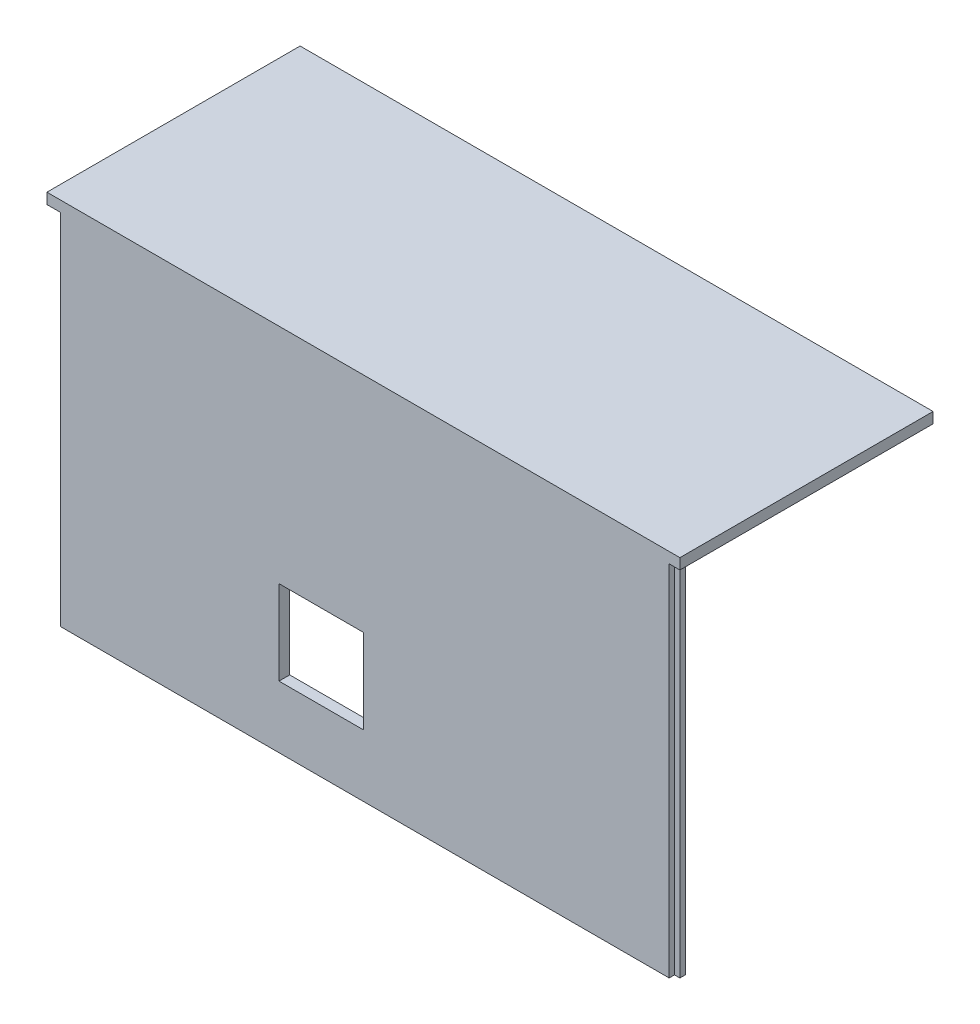
ISO-10303-21;
HEADER;
FILE_DESCRIPTION(('STEP AP214'),'2;1');
FILE_NAME('part.step','',(''),(''),'','','');
FILE_SCHEMA(('AUTOMOTIVE_DESIGN { 1 0 10303 214 1 1 1 1 }'));
ENDSEC;
DATA;
#1=APPLICATION_CONTEXT('core data for automotive mechanical design processes');
#2=APPLICATION_PROTOCOL_DEFINITION('international standard','automotive_design',2000,#1);
#3=PRODUCT_CONTEXT('',#1,'mechanical');
#4=PRODUCT('Part','Part','',(#3));
#5=PRODUCT_RELATED_PRODUCT_CATEGORY('part','',(#4));
#6=PRODUCT_DEFINITION_FORMATION('','',#4);
#7=PRODUCT_DEFINITION_CONTEXT('part definition',#1,'design');
#8=PRODUCT_DEFINITION('design','',#6,#7);
#9=PRODUCT_DEFINITION_SHAPE('','',#8);
#10=(LENGTH_UNIT() NAMED_UNIT(*) SI_UNIT(.MILLI.,.METRE.));
#11=(NAMED_UNIT(*) PLANE_ANGLE_UNIT() SI_UNIT($,.RADIAN.));
#12=(NAMED_UNIT(*) SI_UNIT($,.STERADIAN.) SOLID_ANGLE_UNIT());
#13=UNCERTAINTY_MEASURE_WITH_UNIT(LENGTH_MEASURE(1.E-05),#10,'distance_accuracy_value','');
#14=(GEOMETRIC_REPRESENTATION_CONTEXT(3) GLOBAL_UNCERTAINTY_ASSIGNED_CONTEXT((#13)) GLOBAL_UNIT_ASSIGNED_CONTEXT((#10,
#11,#12)) REPRESENTATION_CONTEXT('',''));
#15=CARTESIAN_POINT('',(0.,0.,0.));
#16=DIRECTION('',(0.,0.,1.));
#17=DIRECTION('',(1.,0.,0.));
#18=AXIS2_PLACEMENT_3D('',#15,#16,#17);
#19=CARTESIAN_POINT('',(-72.8419921910765,-37.8581661594516,2.54));
#20=DIRECTION('',(0.,1.,0.));
#21=DIRECTION('',(0.,0.,1.));
#22=AXIS2_PLACEMENT_3D('',#19,#20,#21);
#23=PLANE('',#22);
#24=DIRECTION('',(1.,0.,0.));
#25=VECTOR('',#24,1.);
#26=CARTESIAN_POINT('',(-72.8419921910765,-37.8581661594516,2.54));
#27=LINE('',#26,#25);
#28=CARTESIAN_POINT('',(-69.6669921910764,-37.8581661594516,2.54));
#29=VERTEX_POINT('',#28);
#30=CARTESIAN_POINT('',(74.6180078089236,-37.8581661594516,2.54));
#31=VERTEX_POINT('',#30);
#32=EDGE_CURVE('E343',#29,#31,#27,.T.);
#33=ORIENTED_EDGE('',*,*,#32,.F.);
#34=DIRECTION('',(0.,0.,-1.));
#35=VECTOR('',#34,1.);
#36=CARTESIAN_POINT('',(-69.6669921910764,-37.8581661594516,1.27));
#37=LINE('',#36,#35);
#38=CARTESIAN_POINT('',(-69.6669921910764,-37.8581661594516,1.27));
#39=VERTEX_POINT('',#38);
#40=EDGE_CURVE('E214',#29,#39,#37,.T.);
#41=ORIENTED_EDGE('',*,*,#40,.T.);
#42=DIRECTION('',(-1.,0.,0.));
#43=VECTOR('',#42,1.);
#44=CARTESIAN_POINT('',(-70.9369921910764,-37.8581661594516,1.27));
#45=LINE('',#44,#43);
#46=CARTESIAN_POINT('',(-70.9369921910764,-37.8581661594516,1.27));
#47=VERTEX_POINT('',#46);
#48=EDGE_CURVE('E205',#39,#47,#45,.T.);
#49=ORIENTED_EDGE('',*,*,#48,.T.);
#50=DIRECTION('',(0.,0.,-1.));
#51=VECTOR('',#50,1.);
#52=CARTESIAN_POINT('',(-70.9369921910764,-37.8581661594516,0.));
#53=LINE('',#52,#51);
#54=CARTESIAN_POINT('',(-70.9369921910764,-37.8581661594516,0.));
#55=VERTEX_POINT('',#54);
#56=EDGE_CURVE('E209',#47,#55,#53,.T.);
#57=ORIENTED_EDGE('',*,*,#56,.T.);
#58=DIRECTION('',(1.,0.,0.));
#59=VECTOR('',#58,1.);
#60=CARTESIAN_POINT('',(-72.8419921910765,-37.8581661594516,0.));
#61=LINE('',#60,#59);
#62=CARTESIAN_POINT('',(75.8880078089236,-37.8581661594516,0.));
#63=VERTEX_POINT('',#62);
#64=EDGE_CURVE('E333',#55,#63,#61,.T.);
#65=ORIENTED_EDGE('',*,*,#64,.T.);
#66=DIRECTION('',(0.,0.,1.));
#67=VECTOR('',#66,1.);
#68=CARTESIAN_POINT('',(75.8880078089236,-37.8581661594516,0.));
#69=LINE('',#68,#67);
#70=CARTESIAN_POINT('',(75.8880078089236,-37.8581661594516,1.27));
#71=VERTEX_POINT('',#70);
#72=EDGE_CURVE('E64',#63,#71,#69,.T.);
#73=ORIENTED_EDGE('',*,*,#72,.T.);
#74=DIRECTION('',(-1.,0.,0.));
#75=VECTOR('',#74,1.);
#76=CARTESIAN_POINT('',(75.8880078089236,-37.8581661594516,1.27));
#77=LINE('',#76,#75);
#78=CARTESIAN_POINT('',(74.6180078089236,-37.8581661594516,1.27));
#79=VERTEX_POINT('',#78);
#80=EDGE_CURVE('E270',#71,#79,#77,.T.);
#81=ORIENTED_EDGE('',*,*,#80,.T.);
#82=DIRECTION('',(0.,0.,1.));
#83=VECTOR('',#82,1.);
#84=CARTESIAN_POINT('',(74.6180078089236,-37.8581661594516,1.27));
#85=LINE('',#84,#83);
#86=EDGE_CURVE('E248',#79,#31,#85,.T.);
#87=ORIENTED_EDGE('',*,*,#86,.T.);
#88=EDGE_LOOP('',(#33,#41,#49,#57,#65,#73,#81,#87));
#89=FACE_BOUND('',#88,.T.);
#90=ADVANCED_FACE('F49',(#89),#23,.F.);
#91=CARTESIAN_POINT('',(0.,0.,2.54));
#92=DIRECTION('',(0.,0.,1.));
#93=DIRECTION('',(1.,0.,0.));
#94=AXIS2_PLACEMENT_3D('',#91,#92,#93);
#95=PLANE('',#94);
#96=DIRECTION('',(0.,1.,0.));
#97=VECTOR('',#96,1.);
#98=CARTESIAN_POINT('',(-69.6669921910764,-37.8581661594516,2.54));
#99=LINE('',#98,#97);
#100=CARTESIAN_POINT('',(-69.6669921910764,47.1418338405484,2.54));
#101=VERTEX_POINT('',#100);
#102=EDGE_CURVE('E235',#29,#101,#99,.T.);
#103=ORIENTED_EDGE('',*,*,#102,.F.);
#104=ORIENTED_EDGE('',*,*,#32,.T.);
#105=DIRECTION('',(0.,1.,0.));
#106=VECTOR('',#105,1.);
#107=CARTESIAN_POINT('',(74.6180078089236,-37.8581661594516,2.54));
#108=LINE('',#107,#106);
#109=CARTESIAN_POINT('',(74.6180078089236,47.1418338405484,2.54));
#110=VERTEX_POINT('',#109);
#111=EDGE_CURVE('E191',#31,#110,#108,.T.);
#112=ORIENTED_EDGE('',*,*,#111,.T.);
#113=DIRECTION('',(1.,0.,0.));
#114=VECTOR('',#113,1.);
#115=CARTESIAN_POINT('',(-72.8419921910765,47.1418338405484,2.54));
#116=LINE('',#115,#114);
#117=CARTESIAN_POINT('',(77.1580078089235,47.1418338405484,2.54));
#118=VERTEX_POINT('',#117);
#119=EDGE_CURVE('E391',#110,#118,#116,.T.);
#120=ORIENTED_EDGE('',*,*,#119,.T.);
#121=DIRECTION('',(0.,-1.,0.));
#122=VECTOR('',#121,1.);
#123=CARTESIAN_POINT('',(77.1580078089235,49.6818338405484,2.54));
#124=LINE('',#123,#122);
#125=CARTESIAN_POINT('',(77.1580078089235,49.6818338405484,2.54));
#126=VERTEX_POINT('',#125);
#127=EDGE_CURVE('E201',#126,#118,#124,.T.);
#128=ORIENTED_EDGE('',*,*,#127,.F.);
#129=DIRECTION('',(1.,0.,0.));
#130=VECTOR('',#129,1.);
#131=CARTESIAN_POINT('',(-72.8419921910765,49.6818338405484,2.54));
#132=LINE('',#131,#130);
#133=CARTESIAN_POINT('',(-72.8419921910765,49.6818338405484,2.54));
#134=VERTEX_POINT('',#133);
#135=EDGE_CURVE('E174',#134,#126,#132,.T.);
#136=ORIENTED_EDGE('',*,*,#135,.F.);
#137=DIRECTION('',(0.,-1.,0.));
#138=VECTOR('',#137,1.);
#139=CARTESIAN_POINT('',(-72.8419921910765,49.6818338405484,2.54));
#140=LINE('',#139,#138);
#141=CARTESIAN_POINT('',(-72.8419921910765,47.1418338405484,2.54));
#142=VERTEX_POINT('',#141);
#143=EDGE_CURVE('E170',#134,#142,#140,.T.);
#144=ORIENTED_EDGE('',*,*,#143,.T.);
#145=EDGE_CURVE('E385',#142,#101,#116,.T.);
#146=ORIENTED_EDGE('',*,*,#145,.T.);
#147=EDGE_LOOP('',(#103,#104,#112,#120,#128,#136,#144,#146));
#148=FACE_BOUND('',#147,.T.);
#149=DIRECTION('',(0.,-1.,0.));
#150=VECTOR('',#149,1.);
#151=CARTESIAN_POINT('',(2.15800780892356,-23.1581661594516,2.54));
#152=LINE('',#151,#150);
#153=CARTESIAN_POINT('',(2.15800780892356,-3.15816615945164,2.54));
#154=VERTEX_POINT('',#153);
#155=CARTESIAN_POINT('',(2.15800780892356,-23.1581661594516,2.54));
#156=VERTEX_POINT('',#155);
#157=EDGE_CURVE('E300',#154,#156,#152,.T.);
#158=ORIENTED_EDGE('',*,*,#157,.T.);
#159=DIRECTION('',(-1.,0.,0.));
#160=VECTOR('',#159,1.);
#161=CARTESIAN_POINT('',(-17.8419921910764,-23.1581661594516,2.54));
#162=LINE('',#161,#160);
#163=CARTESIAN_POINT('',(-17.8419921910764,-23.1581661594516,2.54));
#164=VERTEX_POINT('',#163);
#165=EDGE_CURVE('E304',#156,#164,#162,.T.);
#166=ORIENTED_EDGE('',*,*,#165,.T.);
#167=DIRECTION('',(0.,1.,0.));
#168=VECTOR('',#167,1.);
#169=CARTESIAN_POINT('',(-17.8419921910764,-23.1581661594516,2.54));
#170=LINE('',#169,#168);
#171=CARTESIAN_POINT('',(-17.8419921910764,-3.15816615945163,2.54));
#172=VERTEX_POINT('',#171);
#173=EDGE_CURVE('E309',#164,#172,#170,.T.);
#174=ORIENTED_EDGE('',*,*,#173,.T.);
#175=DIRECTION('',(1.,0.,0.));
#176=VECTOR('',#175,1.);
#177=CARTESIAN_POINT('',(-17.8419921910764,-3.15816615945163,2.54));
#178=LINE('',#177,#176);
#179=EDGE_CURVE('E313',#172,#154,#178,.T.);
#180=ORIENTED_EDGE('',*,*,#179,.T.);
#181=EDGE_LOOP('',(#158,#166,#174,#180));
#182=FACE_BOUND('',#181,.T.);
#183=ADVANCED_FACE('F362',(#148,#182),#95,.T.);
#184=CARTESIAN_POINT('',(0.,0.,0.));
#185=DIRECTION('',(0.,0.,1.));
#186=DIRECTION('',(1.,0.,0.));
#187=AXIS2_PLACEMENT_3D('',#184,#185,#186);
#188=PLANE('',#187);
#189=CARTESIAN_POINT('',(51.1580078089236,-21.8581661594516,0.));
#190=DIRECTION('',(0.,0.,1.));
#191=DIRECTION('',(1.,0.,0.));
#192=AXIS2_PLACEMENT_3D('',#189,#190,#191);
#193=CIRCLE('',#192,3.);
#194=CARTESIAN_POINT('',(54.1580078089236,-21.8581661594516,0.));
#195=VERTEX_POINT('',#194);
#196=EDGE_CURVE('E11',#195,#195,#193,.F.);
#197=ORIENTED_EDGE('',*,*,#196,.F.);
#198=EDGE_LOOP('',(#197));
#199=FACE_BOUND('',#198,.T.);
#200=CARTESIAN_POINT('',(16.1580078089236,-21.8581661594516,0.));
#201=DIRECTION('',(0.,0.,1.));
#202=DIRECTION('',(1.,0.,0.));
#203=AXIS2_PLACEMENT_3D('',#200,#201,#202);
#204=CIRCLE('',#203,3.);
#205=CARTESIAN_POINT('',(19.1580078089236,-21.8581661594516,0.));
#206=VERTEX_POINT('',#205);
#207=EDGE_CURVE('E57',#206,#206,#204,.F.);
#208=ORIENTED_EDGE('',*,*,#207,.F.);
#209=EDGE_LOOP('',(#208));
#210=FACE_BOUND('',#209,.T.);
#211=DIRECTION('',(-1.,0.,0.));
#212=VECTOR('',#211,1.);
#213=CARTESIAN_POINT('',(-17.8419921910764,-23.1581661594516,0.));
#214=LINE('',#213,#212);
#215=CARTESIAN_POINT('',(2.15800780892356,-23.1581661594516,0.));
#216=VERTEX_POINT('',#215);
#217=CARTESIAN_POINT('',(-17.8419921910764,-23.1581661594516,0.));
#218=VERTEX_POINT('',#217);
#219=EDGE_CURVE('E320',#216,#218,#214,.T.);
#220=ORIENTED_EDGE('',*,*,#219,.F.);
#221=DIRECTION('',(0.,-1.,0.));
#222=VECTOR('',#221,1.);
#223=CARTESIAN_POINT('',(2.15800780892356,-23.1581661594516,0.));
#224=LINE('',#223,#222);
#225=CARTESIAN_POINT('',(2.15800780892356,-3.15816615945164,0.));
#226=VERTEX_POINT('',#225);
#227=EDGE_CURVE('E296',#226,#216,#224,.T.);
#228=ORIENTED_EDGE('',*,*,#227,.F.);
#229=DIRECTION('',(1.,0.,0.));
#230=VECTOR('',#229,1.);
#231=CARTESIAN_POINT('',(-17.8419921910764,-3.15816615945163,0.));
#232=LINE('',#231,#230);
#233=CARTESIAN_POINT('',(-17.8419921910764,-3.15816615945163,0.));
#234=VERTEX_POINT('',#233);
#235=EDGE_CURVE('E305',#234,#226,#232,.T.);
#236=ORIENTED_EDGE('',*,*,#235,.F.);
#237=DIRECTION('',(0.,1.,0.));
#238=VECTOR('',#237,1.);
#239=CARTESIAN_POINT('',(-17.8419921910764,-23.1581661594516,0.));
#240=LINE('',#239,#238);
#241=EDGE_CURVE('E323',#218,#234,#240,.T.);
#242=ORIENTED_EDGE('',*,*,#241,.F.);
#243=EDGE_LOOP('',(#220,#228,#236,#242));
#244=FACE_BOUND('',#243,.T.);
#245=ORIENTED_EDGE('',*,*,#64,.F.);
#246=DIRECTION('',(0.,1.,0.));
#247=VECTOR('',#246,1.);
#248=CARTESIAN_POINT('',(-70.9369921910764,-37.8581661594516,0.));
#249=LINE('',#248,#247);
#250=CARTESIAN_POINT('',(-70.9369921910764,47.1418338405484,0.));
#251=VERTEX_POINT('',#250);
#252=EDGE_CURVE('E238',#55,#251,#249,.T.);
#253=ORIENTED_EDGE('',*,*,#252,.T.);
#254=DIRECTION('',(-1.,0.,0.));
#255=VECTOR('',#254,1.);
#256=CARTESIAN_POINT('',(-72.8419921910764,47.1418338405484,0.));
#257=LINE('',#256,#255);
#258=CARTESIAN_POINT('',(75.8880078089236,47.1418338405484,0.));
#259=VERTEX_POINT('',#258);
#260=EDGE_CURVE('E72',#259,#251,#257,.T.);
#261=ORIENTED_EDGE('',*,*,#260,.F.);
#262=DIRECTION('',(0.,1.,0.));
#263=VECTOR('',#262,1.);
#264=CARTESIAN_POINT('',(75.8880078089236,-37.8581661594516,0.));
#265=LINE('',#264,#263);
#266=EDGE_CURVE('E245',#63,#259,#265,.T.);
#267=ORIENTED_EDGE('',*,*,#266,.F.);
#268=EDGE_LOOP('',(#245,#253,#261,#267));
#269=FACE_BOUND('',#268,.T.);
#270=ADVANCED_FACE('F358',(#199,#210,#244,#269),#188,.F.);
#271=CARTESIAN_POINT('',(2.15800780892356,-23.1581661594516,2.54));
#272=DIRECTION('',(1.,0.,0.));
#273=DIRECTION('',(0.,1.,0.));
#274=AXIS2_PLACEMENT_3D('',#271,#272,#273);
#275=PLANE('',#274);
#276=ORIENTED_EDGE('',*,*,#227,.T.);
#277=DIRECTION('',(0.,0.,-1.));
#278=VECTOR('',#277,1.);
#279=CARTESIAN_POINT('',(2.15800780892356,-23.1581661594516,2.54));
#280=LINE('',#279,#278);
#281=EDGE_CURVE('E317',#156,#216,#280,.T.);
#282=ORIENTED_EDGE('',*,*,#281,.F.);
#283=ORIENTED_EDGE('',*,*,#157,.F.);
#284=DIRECTION('',(0.,0.,-1.));
#285=VECTOR('',#284,1.);
#286=CARTESIAN_POINT('',(2.15800780892356,-3.15816615945164,2.54));
#287=LINE('',#286,#285);
#288=EDGE_CURVE('E330',#154,#226,#287,.T.);
#289=ORIENTED_EDGE('',*,*,#288,.T.);
#290=EDGE_LOOP('',(#276,#282,#283,#289));
#291=FACE_BOUND('',#290,.T.);
#292=ADVANCED_FACE('F361',(#291),#275,.F.);
#293=CARTESIAN_POINT('',(-17.8419921910764,-3.15816615945163,2.54));
#294=DIRECTION('',(0.,1.,0.));
#295=DIRECTION('',(-1.,0.,0.));
#296=AXIS2_PLACEMENT_3D('',#293,#294,#295);
#297=PLANE('',#296);
#298=ORIENTED_EDGE('',*,*,#235,.T.);
#299=ORIENTED_EDGE('',*,*,#288,.F.);
#300=ORIENTED_EDGE('',*,*,#179,.F.);
#301=DIRECTION('',(0.,0.,-1.));
#302=VECTOR('',#301,1.);
#303=CARTESIAN_POINT('',(-17.8419921910764,-3.15816615945163,2.54));
#304=LINE('',#303,#302);
#305=EDGE_CURVE('E334',#172,#234,#304,.T.);
#306=ORIENTED_EDGE('',*,*,#305,.T.);
#307=EDGE_LOOP('',(#298,#299,#300,#306));
#308=FACE_BOUND('',#307,.T.);
#309=ADVANCED_FACE('F484',(#308),#297,.F.);
#310=CARTESIAN_POINT('',(-17.8419921910764,-23.1581661594516,2.54));
#311=DIRECTION('',(-1.,0.,0.));
#312=DIRECTION('',(0.,-1.,0.));
#313=AXIS2_PLACEMENT_3D('',#310,#311,#312);
#314=PLANE('',#313);
#315=ORIENTED_EDGE('',*,*,#241,.T.);
#316=ORIENTED_EDGE('',*,*,#305,.F.);
#317=ORIENTED_EDGE('',*,*,#173,.F.);
#318=DIRECTION('',(0.,0.,-1.));
#319=VECTOR('',#318,1.);
#320=CARTESIAN_POINT('',(-17.8419921910764,-23.1581661594516,2.54));
#321=LINE('',#320,#319);
#322=EDGE_CURVE('E337',#164,#218,#321,.T.);
#323=ORIENTED_EDGE('',*,*,#322,.T.);
#324=EDGE_LOOP('',(#315,#316,#317,#323));
#325=FACE_BOUND('',#324,.T.);
#326=ADVANCED_FACE('F489',(#325),#314,.F.);
#327=CARTESIAN_POINT('',(-17.8419921910764,-23.1581661594516,2.54));
#328=DIRECTION('',(0.,-1.,0.));
#329=DIRECTION('',(1.,0.,0.));
#330=AXIS2_PLACEMENT_3D('',#327,#328,#329);
#331=PLANE('',#330);
#332=ORIENTED_EDGE('',*,*,#219,.T.);
#333=ORIENTED_EDGE('',*,*,#322,.F.);
#334=ORIENTED_EDGE('',*,*,#165,.F.);
#335=ORIENTED_EDGE('',*,*,#281,.T.);
#336=EDGE_LOOP('',(#332,#333,#334,#335));
#337=FACE_BOUND('',#336,.T.);
#338=ADVANCED_FACE('F486',(#337),#331,.F.);
#339=CARTESIAN_POINT('',(16.1580078089236,-21.8581661594516,-8.));
#340=DIRECTION('',(0.,0.,1.));
#341=DIRECTION('',(1.,0.,0.));
#342=AXIS2_PLACEMENT_3D('',#339,#340,#341);
#343=CYLINDRICAL_SURFACE('',#342,3.);
#344=CARTESIAN_POINT('',(16.1580078089236,-21.8581661594516,-8.));
#345=DIRECTION('',(0.,0.,-1.));
#346=DIRECTION('',(-1.,0.,0.));
#347=AXIS2_PLACEMENT_3D('',#344,#345,#346);
#348=CIRCLE('',#347,3.);
#349=CARTESIAN_POINT('',(13.1580078089236,-21.8581661594516,-8.));
#350=VERTEX_POINT('',#349);
#351=EDGE_CURVE('E280',#350,#350,#348,.T.);
#352=ORIENTED_EDGE('',*,*,#351,.F.);
#353=EDGE_LOOP('',(#352));
#354=FACE_BOUND('',#353,.T.);
#355=ORIENTED_EDGE('',*,*,#207,.T.);
#356=EDGE_LOOP('',(#355));
#357=FACE_BOUND('',#356,.T.);
#358=ADVANCED_FACE('F356',(#354,#357),#343,.T.);
#359=CARTESIAN_POINT('',(16.1580078089236,-21.8581661594516,-8.));
#360=DIRECTION('',(0.,0.,-1.));
#361=DIRECTION('',(-1.,0.,0.));
#362=AXIS2_PLACEMENT_3D('',#359,#360,#361);
#363=PLANE('',#362);
#364=CARTESIAN_POINT('',(16.1580078089236,-21.8581661594516,-8.));
#365=DIRECTION('',(0.,0.,-1.));
#366=DIRECTION('',(-1.,0.,0.));
#367=AXIS2_PLACEMENT_3D('',#364,#365,#366);
#368=CIRCLE('',#367,0.499999999999999);
#369=CARTESIAN_POINT('',(15.6580078089236,-21.8581661594516,-8.));
#370=VERTEX_POINT('',#369);
#371=EDGE_CURVE('E285',#370,#370,#368,.T.);
#372=ORIENTED_EDGE('',*,*,#371,.F.);
#373=EDGE_LOOP('',(#372));
#374=FACE_BOUND('',#373,.T.);
#375=ORIENTED_EDGE('',*,*,#351,.T.);
#376=EDGE_LOOP('',(#375));
#377=FACE_BOUND('',#376,.T.);
#378=ADVANCED_FACE('F497',(#374,#377),#363,.T.);
#379=CARTESIAN_POINT('',(51.1580078089236,-21.8581661594516,-8.));
#380=DIRECTION('',(0.,0.,1.));
#381=DIRECTION('',(1.,0.,0.));
#382=AXIS2_PLACEMENT_3D('',#379,#380,#381);
#383=CYLINDRICAL_SURFACE('',#382,3.);
#384=CARTESIAN_POINT('',(51.1580078089236,-21.8581661594516,-8.));
#385=DIRECTION('',(0.,0.,-1.));
#386=DIRECTION('',(-1.,0.,0.));
#387=AXIS2_PLACEMENT_3D('',#384,#385,#386);
#388=CIRCLE('',#387,3.);
#389=CARTESIAN_POINT('',(48.1580078089236,-21.8581661594516,-8.));
#390=VERTEX_POINT('',#389);
#391=EDGE_CURVE('E292',#390,#390,#388,.T.);
#392=ORIENTED_EDGE('',*,*,#391,.F.);
#393=EDGE_LOOP('',(#392));
#394=FACE_BOUND('',#393,.T.);
#395=ORIENTED_EDGE('',*,*,#196,.T.);
#396=EDGE_LOOP('',(#395));
#397=FACE_BOUND('',#396,.T.);
#398=ADVANCED_FACE('F500',(#394,#397),#383,.T.);
#399=CARTESIAN_POINT('',(51.1580078089236,-21.8581661594516,-8.));
#400=DIRECTION('',(0.,0.,-1.));
#401=DIRECTION('',(-1.,0.,0.));
#402=AXIS2_PLACEMENT_3D('',#399,#400,#401);
#403=PLANE('',#402);
#404=CARTESIAN_POINT('',(51.1580078089236,-21.8581661594516,-8.));
#405=DIRECTION('',(0.,0.,-1.));
#406=DIRECTION('',(-1.,0.,0.));
#407=AXIS2_PLACEMENT_3D('',#404,#405,#406);
#408=CIRCLE('',#407,0.499999999999999);
#409=CARTESIAN_POINT('',(50.6580078089236,-21.8581661594516,-8.));
#410=VERTEX_POINT('',#409);
#411=EDGE_CURVE('E281',#410,#410,#408,.T.);
#412=ORIENTED_EDGE('',*,*,#411,.F.);
#413=EDGE_LOOP('',(#412));
#414=FACE_BOUND('',#413,.T.);
#415=ORIENTED_EDGE('',*,*,#391,.T.);
#416=EDGE_LOOP('',(#415));
#417=FACE_BOUND('',#416,.T.);
#418=ADVANCED_FACE('F507',(#414,#417),#403,.T.);
#419=CARTESIAN_POINT('',(51.1580078089236,-21.8581661594516,-4.));
#420=DIRECTION('',(0.,0.,-1.));
#421=DIRECTION('',(-1.,0.,0.));
#422=AXIS2_PLACEMENT_3D('',#419,#420,#421);
#423=CYLINDRICAL_SURFACE('',#422,0.499999999999999);
#424=CARTESIAN_POINT('',(51.1580078089236,-21.8581661594516,-4.));
#425=DIRECTION('',(0.,0.,-1.));
#426=DIRECTION('',(-1.,0.,0.));
#427=AXIS2_PLACEMENT_3D('',#424,#425,#426);
#428=CIRCLE('',#427,0.499999999999999);
#429=CARTESIAN_POINT('',(50.6580078089236,-21.8581661594516,-4.));
#430=VERTEX_POINT('',#429);
#431=EDGE_CURVE('E276',#430,#430,#428,.T.);
#432=ORIENTED_EDGE('',*,*,#431,.F.);
#433=EDGE_LOOP('',(#432));
#434=FACE_BOUND('',#433,.T.);
#435=ORIENTED_EDGE('',*,*,#411,.T.);
#436=EDGE_LOOP('',(#435));
#437=FACE_BOUND('',#436,.T.);
#438=ADVANCED_FACE('F511',(#434,#437),#423,.F.);
#439=CARTESIAN_POINT('',(51.1580078089236,-21.8581661594516,-4.));
#440=DIRECTION('',(0.,0.,-1.));
#441=DIRECTION('',(-1.,0.,0.));
#442=AXIS2_PLACEMENT_3D('',#439,#440,#441);
#443=PLANE('',#442);
#444=ORIENTED_EDGE('',*,*,#431,.T.);
#445=EDGE_LOOP('',(#444));
#446=FACE_BOUND('',#445,.T.);
#447=ADVANCED_FACE('F520',(#446),#443,.T.);
#448=CARTESIAN_POINT('',(16.1580078089236,-21.8581661594516,-4.));
#449=DIRECTION('',(0.,0.,-1.));
#450=DIRECTION('',(-1.,0.,0.));
#451=AXIS2_PLACEMENT_3D('',#448,#449,#450);
#452=CYLINDRICAL_SURFACE('',#451,0.499999999999999);
#453=CARTESIAN_POINT('',(16.1580078089236,-21.8581661594516,-4.));
#454=DIRECTION('',(0.,0.,-1.));
#455=DIRECTION('',(-1.,0.,0.));
#456=AXIS2_PLACEMENT_3D('',#453,#454,#455);
#457=CIRCLE('',#456,0.499999999999999);
#458=CARTESIAN_POINT('',(15.6580078089236,-21.8581661594516,-4.));
#459=VERTEX_POINT('',#458);
#460=EDGE_CURVE('E234',#459,#459,#457,.T.);
#461=ORIENTED_EDGE('',*,*,#460,.F.);
#462=EDGE_LOOP('',(#461));
#463=FACE_BOUND('',#462,.T.);
#464=ORIENTED_EDGE('',*,*,#371,.T.);
#465=EDGE_LOOP('',(#464));
#466=FACE_BOUND('',#465,.T.);
#467=ADVANCED_FACE('F516',(#463,#466),#452,.F.);
#468=CARTESIAN_POINT('',(16.1580078089236,-21.8581661594516,-4.));
#469=DIRECTION('',(0.,0.,-1.));
#470=DIRECTION('',(-1.,0.,0.));
#471=AXIS2_PLACEMENT_3D('',#468,#469,#470);
#472=PLANE('',#471);
#473=ORIENTED_EDGE('',*,*,#460,.T.);
#474=EDGE_LOOP('',(#473));
#475=FACE_BOUND('',#474,.T.);
#476=ADVANCED_FACE('F513',(#475),#472,.T.);
#477=CARTESIAN_POINT('',(74.6180078089236,-37.8581661594516,1.27));
#478=DIRECTION('',(-1.,0.,0.));
#479=DIRECTION('',(0.,0.,1.));
#480=AXIS2_PLACEMENT_3D('',#477,#478,#479);
#481=PLANE('',#480);
#482=DIRECTION('',(0.,0.,1.));
#483=VECTOR('',#482,1.);
#484=CARTESIAN_POINT('',(74.6180078089236,47.1418338405484,1.27));
#485=LINE('',#484,#483);
#486=CARTESIAN_POINT('',(74.6180078089236,47.1418338405484,1.27));
#487=VERTEX_POINT('',#486);
#488=EDGE_CURVE('E256',#487,#110,#485,.T.);
#489=ORIENTED_EDGE('',*,*,#488,.T.);
#490=ORIENTED_EDGE('',*,*,#111,.F.);
#491=ORIENTED_EDGE('',*,*,#86,.F.);
#492=DIRECTION('',(0.,1.,0.));
#493=VECTOR('',#492,1.);
#494=CARTESIAN_POINT('',(74.6180078089236,-37.8581661594516,1.27));
#495=LINE('',#494,#493);
#496=EDGE_CURVE('E198',#79,#487,#495,.T.);
#497=ORIENTED_EDGE('',*,*,#496,.T.);
#498=EDGE_LOOP('',(#489,#490,#491,#497));
#499=FACE_BOUND('',#498,.T.);
#500=ADVANCED_FACE('F389',(#499),#481,.F.);
#501=CARTESIAN_POINT('',(75.8880078089236,-37.8581661594516,1.27));
#502=DIRECTION('',(0.,0.,-1.));
#503=DIRECTION('',(-1.,0.,0.));
#504=AXIS2_PLACEMENT_3D('',#501,#502,#503);
#505=PLANE('',#504);
#506=DIRECTION('',(-1.,0.,0.));
#507=VECTOR('',#506,1.);
#508=CARTESIAN_POINT('',(75.8880078089236,47.1418338405484,1.27));
#509=LINE('',#508,#507);
#510=CARTESIAN_POINT('',(75.8880078089236,47.1418338405484,1.27));
#511=VERTEX_POINT('',#510);
#512=EDGE_CURVE('E260',#511,#487,#509,.T.);
#513=ORIENTED_EDGE('',*,*,#512,.T.);
#514=ORIENTED_EDGE('',*,*,#496,.F.);
#515=ORIENTED_EDGE('',*,*,#80,.F.);
#516=DIRECTION('',(0.,1.,0.));
#517=VECTOR('',#516,1.);
#518=CARTESIAN_POINT('',(75.8880078089236,-37.8581661594516,1.27));
#519=LINE('',#518,#517);
#520=EDGE_CURVE('E249',#71,#511,#519,.T.);
#521=ORIENTED_EDGE('',*,*,#520,.T.);
#522=EDGE_LOOP('',(#513,#514,#515,#521));
#523=FACE_BOUND('',#522,.T.);
#524=ADVANCED_FACE('F530',(#523),#505,.F.);
#525=CARTESIAN_POINT('',(75.8880078089236,-37.8581661594516,0.));
#526=DIRECTION('',(-1.,0.,0.));
#527=DIRECTION('',(0.,0.,1.));
#528=AXIS2_PLACEMENT_3D('',#525,#526,#527);
#529=PLANE('',#528);
#530=DIRECTION('',(0.,0.,1.));
#531=VECTOR('',#530,1.);
#532=CARTESIAN_POINT('',(75.8880078089236,47.1418338405484,0.));
#533=LINE('',#532,#531);
#534=EDGE_CURVE('E224',#259,#511,#533,.T.);
#535=ORIENTED_EDGE('',*,*,#534,.T.);
#536=ORIENTED_EDGE('',*,*,#520,.F.);
#537=ORIENTED_EDGE('',*,*,#72,.F.);
#538=ORIENTED_EDGE('',*,*,#266,.T.);
#539=EDGE_LOOP('',(#535,#536,#537,#538));
#540=FACE_BOUND('',#539,.T.);
#541=ADVANCED_FACE('F533',(#540),#529,.F.);
#542=CARTESIAN_POINT('',(-70.9369921910764,-37.8581661594516,1.27));
#543=DIRECTION('',(0.,0.,-1.));
#544=DIRECTION('',(-1.,0.,0.));
#545=AXIS2_PLACEMENT_3D('',#542,#543,#544);
#546=PLANE('',#545);
#547=DIRECTION('',(-1.,0.,0.));
#548=VECTOR('',#547,1.);
#549=CARTESIAN_POINT('',(-70.9369921910764,47.1418338405484,1.27));
#550=LINE('',#549,#548);
#551=CARTESIAN_POINT('',(-69.6669921910764,47.1418338405484,1.27));
#552=VERTEX_POINT('',#551);
#553=CARTESIAN_POINT('',(-70.9369921910764,47.1418338405484,1.27));
#554=VERTEX_POINT('',#553);
#555=EDGE_CURVE('E219',#552,#554,#550,.T.);
#556=ORIENTED_EDGE('',*,*,#555,.T.);
#557=DIRECTION('',(0.,1.,0.));
#558=VECTOR('',#557,1.);
#559=CARTESIAN_POINT('',(-70.9369921910764,-37.8581661594516,1.27));
#560=LINE('',#559,#558);
#561=EDGE_CURVE('E218',#47,#554,#560,.T.);
#562=ORIENTED_EDGE('',*,*,#561,.F.);
#563=ORIENTED_EDGE('',*,*,#48,.F.);
#564=DIRECTION('',(0.,1.,0.));
#565=VECTOR('',#564,1.);
#566=CARTESIAN_POINT('',(-69.6669921910764,-37.8581661594516,1.27));
#567=LINE('',#566,#565);
#568=EDGE_CURVE('E230',#39,#552,#567,.T.);
#569=ORIENTED_EDGE('',*,*,#568,.T.);
#570=EDGE_LOOP('',(#556,#562,#563,#569));
#571=FACE_BOUND('',#570,.T.);
#572=ADVANCED_FACE('F379',(#571),#546,.F.);
#573=CARTESIAN_POINT('',(-69.6669921910764,-37.8581661594516,1.27));
#574=DIRECTION('',(1.,0.,0.));
#575=DIRECTION('',(0.,0.,-1.));
#576=AXIS2_PLACEMENT_3D('',#573,#574,#575);
#577=PLANE('',#576);
#578=DIRECTION('',(0.,0.,-1.));
#579=VECTOR('',#578,1.);
#580=CARTESIAN_POINT('',(-69.6669921910764,47.1418338405484,1.27));
#581=LINE('',#580,#579);
#582=EDGE_CURVE('E210',#101,#552,#581,.T.);
#583=ORIENTED_EDGE('',*,*,#582,.T.);
#584=ORIENTED_EDGE('',*,*,#568,.F.);
#585=ORIENTED_EDGE('',*,*,#40,.F.);
#586=ORIENTED_EDGE('',*,*,#102,.T.);
#587=EDGE_LOOP('',(#583,#584,#585,#586));
#588=FACE_BOUND('',#587,.T.);
#589=ADVANCED_FACE('F381',(#588),#577,.F.);
#590=CARTESIAN_POINT('',(-70.9369921910764,-37.8581661594516,0.));
#591=DIRECTION('',(1.,0.,0.));
#592=DIRECTION('',(0.,0.,-1.));
#593=AXIS2_PLACEMENT_3D('',#590,#591,#592);
#594=PLANE('',#593);
#595=DIRECTION('',(0.,0.,-1.));
#596=VECTOR('',#595,1.);
#597=CARTESIAN_POINT('',(-70.9369921910764,47.1418338405484,0.));
#598=LINE('',#597,#596);
#599=EDGE_CURVE('E223',#554,#251,#598,.T.);
#600=ORIENTED_EDGE('',*,*,#599,.T.);
#601=ORIENTED_EDGE('',*,*,#252,.F.);
#602=ORIENTED_EDGE('',*,*,#56,.F.);
#603=ORIENTED_EDGE('',*,*,#561,.T.);
#604=EDGE_LOOP('',(#600,#601,#602,#603));
#605=FACE_BOUND('',#604,.T.);
#606=ADVANCED_FACE('F374',(#605),#594,.F.);
#607=CARTESIAN_POINT('',(-72.8419921910765,49.6818338405484,-57.46));
#608=DIRECTION('',(0.,0.,1.));
#609=DIRECTION('',(1.,0.,0.));
#610=AXIS2_PLACEMENT_3D('',#607,#608,#609);
#611=PLANE('',#610);
#612=DIRECTION('',(-1.,0.,0.));
#613=VECTOR('',#612,1.);
#614=CARTESIAN_POINT('',(-72.8419921910765,47.1418338405484,-57.46));
#615=LINE('',#614,#613);
#616=CARTESIAN_POINT('',(77.1580078089235,47.1418338405484,-57.46));
#617=VERTEX_POINT('',#616);
#618=CARTESIAN_POINT('',(-72.8419921910765,47.1418338405484,-57.46));
#619=VERTEX_POINT('',#618);
#620=EDGE_CURVE('E189',#617,#619,#615,.T.);
#621=ORIENTED_EDGE('',*,*,#620,.T.);
#622=DIRECTION('',(0.,-1.,0.));
#623=VECTOR('',#622,1.);
#624=CARTESIAN_POINT('',(-72.8419921910765,49.6818338405484,-57.46));
#625=LINE('',#624,#623);
#626=CARTESIAN_POINT('',(-72.8419921910765,49.6818338405484,-57.46));
#627=VERTEX_POINT('',#626);
#628=EDGE_CURVE('E167',#627,#619,#625,.T.);
#629=ORIENTED_EDGE('',*,*,#628,.F.);
#630=DIRECTION('',(-1.,0.,0.));
#631=VECTOR('',#630,1.);
#632=CARTESIAN_POINT('',(-72.8419921910765,49.6818338405484,-57.46));
#633=LINE('',#632,#631);
#634=CARTESIAN_POINT('',(77.1580078089235,49.6818338405484,-57.46));
#635=VERTEX_POINT('',#634);
#636=EDGE_CURVE('E175',#635,#627,#633,.T.);
#637=ORIENTED_EDGE('',*,*,#636,.F.);
#638=DIRECTION('',(0.,-1.,0.));
#639=VECTOR('',#638,1.);
#640=CARTESIAN_POINT('',(77.1580078089235,49.6818338405484,-57.46));
#641=LINE('',#640,#639);
#642=EDGE_CURVE('E400',#635,#617,#641,.T.);
#643=ORIENTED_EDGE('',*,*,#642,.T.);
#644=EDGE_LOOP('',(#621,#629,#637,#643));
#645=FACE_BOUND('',#644,.T.);
#646=ADVANCED_FACE('F187',(#645),#611,.F.);
#647=CARTESIAN_POINT('',(-72.8419921910765,49.6818338405484,2.54));
#648=DIRECTION('',(1.,0.,0.));
#649=DIRECTION('',(0.,0.,-1.));
#650=AXIS2_PLACEMENT_3D('',#647,#648,#649);
#651=PLANE('',#650);
#652=DIRECTION('',(0.,0.,1.));
#653=VECTOR('',#652,1.);
#654=CARTESIAN_POINT('',(-72.8419921910765,47.1418338405484,2.54));
#655=LINE('',#654,#653);
#656=EDGE_CURVE('E395',#619,#142,#655,.T.);
#657=ORIENTED_EDGE('',*,*,#656,.T.);
#658=ORIENTED_EDGE('',*,*,#143,.F.);
#659=DIRECTION('',(0.,0.,1.));
#660=VECTOR('',#659,1.);
#661=CARTESIAN_POINT('',(-72.8419921910765,49.6818338405484,2.54));
#662=LINE('',#661,#660);
#663=EDGE_CURVE('E163',#627,#134,#662,.T.);
#664=ORIENTED_EDGE('',*,*,#663,.F.);
#665=ORIENTED_EDGE('',*,*,#628,.T.);
#666=EDGE_LOOP('',(#657,#658,#664,#665));
#667=FACE_BOUND('',#666,.T.);
#668=ADVANCED_FACE('F165',(#667),#651,.F.);
#669=CARTESIAN_POINT('',(77.1580078089235,49.6818338405484,2.54));
#670=DIRECTION('',(-1.,0.,0.));
#671=DIRECTION('',(0.,0.,1.));
#672=AXIS2_PLACEMENT_3D('',#669,#670,#671);
#673=PLANE('',#672);
#674=DIRECTION('',(0.,0.,-1.));
#675=VECTOR('',#674,1.);
#676=CARTESIAN_POINT('',(77.1580078089235,47.1418338405484,2.54));
#677=LINE('',#676,#675);
#678=EDGE_CURVE('E185',#118,#617,#677,.T.);
#679=ORIENTED_EDGE('',*,*,#678,.T.);
#680=ORIENTED_EDGE('',*,*,#642,.F.);
#681=DIRECTION('',(0.,0.,-1.));
#682=VECTOR('',#681,1.);
#683=CARTESIAN_POINT('',(77.1580078089235,49.6818338405484,2.54));
#684=LINE('',#683,#682);
#685=EDGE_CURVE('E180',#126,#635,#684,.T.);
#686=ORIENTED_EDGE('',*,*,#685,.F.);
#687=ORIENTED_EDGE('',*,*,#127,.T.);
#688=EDGE_LOOP('',(#679,#680,#686,#687));
#689=FACE_BOUND('',#688,.T.);
#690=ADVANCED_FACE('F398',(#689),#673,.F.);
#691=CARTESIAN_POINT('',(0.,49.6818338405484,0.));
#692=DIRECTION('',(0.,1.,0.));
#693=DIRECTION('',(0.,0.,1.));
#694=AXIS2_PLACEMENT_3D('',#691,#692,#693);
#695=PLANE('',#694);
#696=ORIENTED_EDGE('',*,*,#636,.T.);
#697=ORIENTED_EDGE('',*,*,#663,.T.);
#698=ORIENTED_EDGE('',*,*,#135,.T.);
#699=ORIENTED_EDGE('',*,*,#685,.T.);
#700=EDGE_LOOP('',(#696,#697,#698,#699));
#701=FACE_BOUND('',#700,.T.);
#702=ADVANCED_FACE('F178',(#701),#695,.T.);
#703=CARTESIAN_POINT('',(0.,47.1418338405484,0.));
#704=DIRECTION('',(0.,1.,0.));
#705=DIRECTION('',(0.,0.,1.));
#706=AXIS2_PLACEMENT_3D('',#703,#704,#705);
#707=PLANE('',#706);
#708=ORIENTED_EDGE('',*,*,#582,.F.);
#709=ORIENTED_EDGE('',*,*,#145,.F.);
#710=ORIENTED_EDGE('',*,*,#656,.F.);
#711=ORIENTED_EDGE('',*,*,#620,.F.);
#712=ORIENTED_EDGE('',*,*,#678,.F.);
#713=ORIENTED_EDGE('',*,*,#119,.F.);
#714=ORIENTED_EDGE('',*,*,#488,.F.);
#715=ORIENTED_EDGE('',*,*,#512,.F.);
#716=ORIENTED_EDGE('',*,*,#534,.F.);
#717=ORIENTED_EDGE('',*,*,#260,.T.);
#718=ORIENTED_EDGE('',*,*,#599,.F.);
#719=ORIENTED_EDGE('',*,*,#555,.F.);
#720=EDGE_LOOP('',(#708,#709,#710,#711,#712,#713,#714,#715,#716,#717,#718,#719));
#721=FACE_BOUND('',#720,.T.);
#722=ADVANCED_FACE('F375',(#721),#707,.F.);
#723=CLOSED_SHELL('',(#90,#183,#270,#292,#309,#326,#338,#358,#378,#398,#418,#438,#447,#467,#476,
#500,#524,#541,#572,#589,#606,#646,#668,#690,#702,#722));
#724=MANIFOLD_SOLID_BREP('B2',#723);
#725=ADVANCED_BREP_SHAPE_REPRESENTATION('',(#18,#724),#14);
#726=SHAPE_DEFINITION_REPRESENTATION(#9,#725);
ENDSEC;
END-ISO-10303-21;
